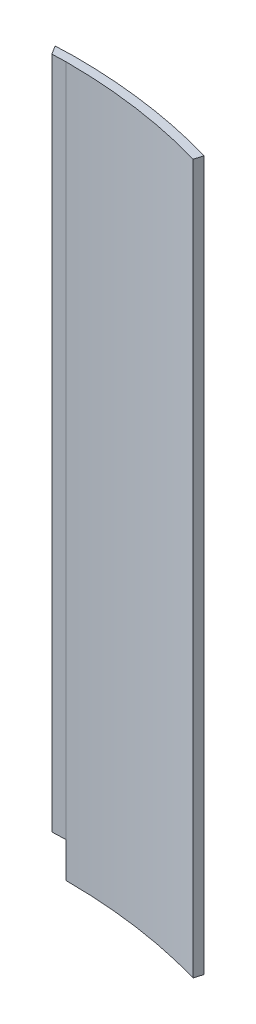
ISO-10303-21;
HEADER;
FILE_DESCRIPTION(('STEP AP214'),'2;1');
FILE_NAME('part.step','',(''),(''),'','','');
FILE_SCHEMA(('AUTOMOTIVE_DESIGN { 1 0 10303 214 1 1 1 1 }'));
ENDSEC;
DATA;
#1=APPLICATION_CONTEXT('core data for automotive mechanical design processes');
#2=APPLICATION_PROTOCOL_DEFINITION('international standard','automotive_design',2000,#1);
#3=PRODUCT_CONTEXT('',#1,'mechanical');
#4=PRODUCT('Part','Part','',(#3));
#5=PRODUCT_RELATED_PRODUCT_CATEGORY('part','',(#4));
#6=PRODUCT_DEFINITION_FORMATION('','',#4);
#7=PRODUCT_DEFINITION_CONTEXT('part definition',#1,'design');
#8=PRODUCT_DEFINITION('design','',#6,#7);
#9=PRODUCT_DEFINITION_SHAPE('','',#8);
#10=(LENGTH_UNIT() NAMED_UNIT(*) SI_UNIT(.MILLI.,.METRE.));
#11=(NAMED_UNIT(*) PLANE_ANGLE_UNIT() SI_UNIT($,.RADIAN.));
#12=(NAMED_UNIT(*) SI_UNIT($,.STERADIAN.) SOLID_ANGLE_UNIT());
#13=UNCERTAINTY_MEASURE_WITH_UNIT(LENGTH_MEASURE(1.E-05),#10,'distance_accuracy_value','');
#14=(GEOMETRIC_REPRESENTATION_CONTEXT(3) GLOBAL_UNCERTAINTY_ASSIGNED_CONTEXT((#13)) GLOBAL_UNIT_ASSIGNED_CONTEXT((#10,
#11,#12)) REPRESENTATION_CONTEXT('',''));
#15=CARTESIAN_POINT('',(0.,0.,0.));
#16=DIRECTION('',(0.,0.,1.));
#17=DIRECTION('',(1.,0.,0.));
#18=AXIS2_PLACEMENT_3D('',#15,#16,#17);
#19=CARTESIAN_POINT('',(0.,2000.,0.));
#20=DIRECTION('',(0.,-1.,0.));
#21=DIRECTION('',(0.,0.,-1.));
#22=AXIS2_PLACEMENT_3D('',#19,#20,#21);
#23=CYLINDRICAL_SURFACE('',#22,1540.);
#24=CARTESIAN_POINT('',(0.,0.,0.));
#25=DIRECTION('',(0.,1.,0.));
#26=DIRECTION('',(0.,0.,-1.));
#27=AXIS2_PLACEMENT_3D('',#24,#25,#26);
#28=CIRCLE('',#27,1540.);
#29=CARTESIAN_POINT('',(424.481527958169,0.,-1480.34301174501));
#30=VERTEX_POINT('',#29);
#31=CARTESIAN_POINT('',(0.,0.,-1540.));
#32=VERTEX_POINT('',#31);
#33=EDGE_CURVE('E92',#30,#32,#28,.T.);
#34=ORIENTED_EDGE('',*,*,#33,.T.);
#35=DIRECTION('',(0.,-1.,0.));
#36=VECTOR('',#35,1.);
#37=CARTESIAN_POINT('',(0.,2000.,-1540.));
#38=LINE('',#37,#36);
#39=CARTESIAN_POINT('',(0.,100.,-1540.));
#40=VERTEX_POINT('',#39);
#41=EDGE_CURVE('E43',#40,#32,#38,.T.);
#42=ORIENTED_EDGE('',*,*,#41,.F.);
#43=CARTESIAN_POINT('',(0.,2000.,-1540.));
#44=VERTEX_POINT('',#43);
#45=EDGE_CURVE('E11',#44,#40,#38,.T.);
#46=ORIENTED_EDGE('',*,*,#45,.F.);
#47=CARTESIAN_POINT('',(0.,2000.,0.));
#48=DIRECTION('',(0.,1.,0.));
#49=DIRECTION('',(0.,0.,-1.));
#50=AXIS2_PLACEMENT_3D('',#47,#48,#49);
#51=CIRCLE('',#50,1540.);
#52=CARTESIAN_POINT('',(424.481527958169,2000.,-1480.34301174501));
#53=VERTEX_POINT('',#52);
#54=EDGE_CURVE('E86',#53,#44,#51,.T.);
#55=ORIENTED_EDGE('',*,*,#54,.F.);
#56=DIRECTION('',(0.,-1.,0.));
#57=VECTOR('',#56,1.);
#58=CARTESIAN_POINT('',(424.481527958169,2000.,-1480.34301174501));
#59=LINE('',#58,#57);
#60=EDGE_CURVE('E79',#53,#30,#59,.T.);
#61=ORIENTED_EDGE('',*,*,#60,.T.);
#62=EDGE_LOOP('',(#34,#42,#46,#55,#61));
#63=FACE_BOUND('',#62,.T.);
#64=ADVANCED_FACE('F36',(#63),#23,.T.);
#65=CARTESIAN_POINT('',(0.,2000.,-1540.));
#66=DIRECTION('',(1.,0.,0.));
#67=DIRECTION('',(0.,0.,-1.));
#68=AXIS2_PLACEMENT_3D('',#65,#66,#67);
#69=PLANE('',#68);
#70=DIRECTION('',(0.,-1.,0.));
#71=VECTOR('',#70,1.);
#72=CARTESIAN_POINT('',(0.,2000.,-1515.));
#73=LINE('',#72,#71);
#74=CARTESIAN_POINT('',(0.,100.,-1515.));
#75=VERTEX_POINT('',#74);
#76=CARTESIAN_POINT('',(0.,0.,-1515.));
#77=VERTEX_POINT('',#76);
#78=EDGE_CURVE('E107',#75,#77,#73,.T.);
#79=ORIENTED_EDGE('',*,*,#78,.F.);
#80=DIRECTION('',(0.,0.,-1.));
#81=VECTOR('',#80,1.);
#82=CARTESIAN_POINT('',(0.,100.,0.));
#83=LINE('',#82,#81);
#84=EDGE_CURVE('E101',#75,#40,#83,.T.);
#85=ORIENTED_EDGE('',*,*,#84,.T.);
#86=ORIENTED_EDGE('',*,*,#41,.T.);
#87=DIRECTION('',(0.,0.,1.));
#88=VECTOR('',#87,1.);
#89=CARTESIAN_POINT('',(0.,0.,-1540.));
#90=LINE('',#89,#88);
#91=EDGE_CURVE('E97',#32,#77,#90,.T.);
#92=ORIENTED_EDGE('',*,*,#91,.T.);
#93=EDGE_LOOP('',(#79,#85,#86,#92));
#94=FACE_BOUND('',#93,.T.);
#95=ADVANCED_FACE('F118',(#94),#69,.F.);
#96=CARTESIAN_POINT('',(0.,2000.,0.));
#97=DIRECTION('',(0.,-1.,0.));
#98=DIRECTION('',(0.,0.,-1.));
#99=AXIS2_PLACEMENT_3D('',#96,#97,#98);
#100=CYLINDRICAL_SURFACE('',#99,1515.);
#101=CARTESIAN_POINT('',(0.,0.,0.));
#102=DIRECTION('',(0.,-1.,0.));
#103=DIRECTION('',(0.,0.,-1.));
#104=AXIS2_PLACEMENT_3D('',#101,#102,#103);
#105=CIRCLE('',#104,1515.);
#106=CARTESIAN_POINT('',(417.590594062744,0.,-1456.31146934656));
#107=VERTEX_POINT('',#106);
#108=EDGE_CURVE('E87',#77,#107,#105,.T.);
#109=ORIENTED_EDGE('',*,*,#108,.T.);
#110=DIRECTION('',(0.,-1.,0.));
#111=VECTOR('',#110,1.);
#112=CARTESIAN_POINT('',(417.590594062744,2000.,-1456.31146934656));
#113=LINE('',#112,#111);
#114=CARTESIAN_POINT('',(417.590594062744,2000.,-1456.31146934656));
#115=VERTEX_POINT('',#114);
#116=EDGE_CURVE('E82',#115,#107,#113,.T.);
#117=ORIENTED_EDGE('',*,*,#116,.F.);
#118=CARTESIAN_POINT('',(0.,2000.,0.));
#119=DIRECTION('',(0.,-1.,0.));
#120=DIRECTION('',(0.,0.,-1.));
#121=AXIS2_PLACEMENT_3D('',#118,#119,#120);
#122=CIRCLE('',#121,1515.);
#123=CARTESIAN_POINT('',(0.,2000.,-1515.));
#124=VERTEX_POINT('',#123);
#125=EDGE_CURVE('E163',#124,#115,#122,.T.);
#126=ORIENTED_EDGE('',*,*,#125,.F.);
#127=EDGE_CURVE('E108',#124,#75,#73,.T.);
#128=ORIENTED_EDGE('',*,*,#127,.T.);
#129=ORIENTED_EDGE('',*,*,#78,.T.);
#130=EDGE_LOOP('',(#109,#117,#126,#128,#129));
#131=FACE_BOUND('',#130,.T.);
#132=ADVANCED_FACE('F115',(#131),#100,.F.);
#133=CARTESIAN_POINT('',(424.481527958169,2000.,-1480.34301174501));
#134=DIRECTION('',(-0.961261695938321,0.,-0.275637355816991));
#135=DIRECTION('',(-0.275637355816991,0.,0.961261695938321));
#136=AXIS2_PLACEMENT_3D('',#133,#134,#135);
#137=PLANE('',#136);
#138=DIRECTION('',(0.275637355816991,0.,-0.961261695938321));
#139=VECTOR('',#138,1.);
#140=CARTESIAN_POINT('',(424.481527958169,0.,-1480.34301174501));
#141=LINE('',#140,#139);
#142=EDGE_CURVE('E76',#107,#30,#141,.T.);
#143=ORIENTED_EDGE('',*,*,#142,.T.);
#144=ORIENTED_EDGE('',*,*,#60,.F.);
#145=DIRECTION('',(0.275637355816991,0.,-0.961261695938321));
#146=VECTOR('',#145,1.);
#147=CARTESIAN_POINT('',(424.481527958169,2000.,-1480.34301174501));
#148=LINE('',#147,#146);
#149=EDGE_CURVE('E57',#115,#53,#148,.T.);
#150=ORIENTED_EDGE('',*,*,#149,.F.);
#151=ORIENTED_EDGE('',*,*,#116,.T.);
#152=EDGE_LOOP('',(#143,#144,#150,#151));
#153=FACE_BOUND('',#152,.T.);
#154=ADVANCED_FACE('F78',(#153),#137,.F.);
#155=CARTESIAN_POINT('',(0.,2000.,0.));
#156=DIRECTION('',(0.,-1.,0.));
#157=DIRECTION('',(0.,0.,-1.));
#158=AXIS2_PLACEMENT_3D('',#155,#156,#157);
#159=PLANE('',#158);
#160=ORIENTED_EDGE('',*,*,#54,.T.);
#161=DIRECTION('',(-0.999390827019162,0.,0.0348994967006073));
#162=VECTOR('',#161,1.);
#163=CARTESIAN_POINT('',(-53.7124847800655,2000.,-1538.12431870027));
#164=LINE('',#163,#162);
#165=CARTESIAN_POINT('',(-53.7124847830172,2000.,-1538.12431870017));
#166=VERTEX_POINT('',#165);
#167=EDGE_CURVE('E125',#44,#166,#164,.T.);
#168=ORIENTED_EDGE('',*,*,#167,.T.);
#169=DIRECTION('',(0.52991926423161,0.,0.848048096157423));
#170=VECTOR('',#169,1.);
#171=CARTESIAN_POINT('',(652.599245889357,2000.,-407.789267833692));
#172=LINE('',#171,#170);
#173=CARTESIAN_POINT('',(-38.4243520844523,2000.,-1513.65819205799));
#174=VERTEX_POINT('',#173);
#175=EDGE_CURVE('E165',#166,#174,#172,.T.);
#176=ORIENTED_EDGE('',*,*,#175,.T.);
#177=DIRECTION('',(-0.999390827019094,0.,0.03489949670256));
#178=VECTOR('',#177,1.);
#179=CARTESIAN_POINT('',(-52.8405288612642,2000.,-1513.15476807181));
#180=LINE('',#179,#178);
#181=EDGE_CURVE('E156',#124,#174,#180,.T.);
#182=ORIENTED_EDGE('',*,*,#181,.F.);
#183=ORIENTED_EDGE('',*,*,#125,.T.);
#184=ORIENTED_EDGE('',*,*,#149,.T.);
#185=EDGE_LOOP('',(#160,#168,#176,#182,#183,#184));
#186=FACE_BOUND('',#185,.T.);
#187=ADVANCED_FACE('F164',(#186),#159,.F.);
#188=CARTESIAN_POINT('',(0.,0.,0.));
#189=DIRECTION('',(0.,-1.,0.));
#190=DIRECTION('',(0.,0.,-1.));
#191=AXIS2_PLACEMENT_3D('',#188,#189,#190);
#192=PLANE('',#191);
#193=ORIENTED_EDGE('',*,*,#33,.F.);
#194=ORIENTED_EDGE('',*,*,#142,.F.);
#195=ORIENTED_EDGE('',*,*,#108,.F.);
#196=ORIENTED_EDGE('',*,*,#91,.F.);
#197=EDGE_LOOP('',(#193,#194,#195,#196));
#198=FACE_BOUND('',#197,.T.);
#199=ADVANCED_FACE('F95',(#198),#192,.T.);
#200=CARTESIAN_POINT('',(-52.8405288612642,40.1759089728917,-1513.15476807181));
#201=DIRECTION('',(-0.03489949670256,0.,-0.999390827019094));
#202=DIRECTION('',(-0.999390827019094,0.,0.03489949670256));
#203=AXIS2_PLACEMENT_3D('',#200,#201,#202);
#204=PLANE('',#203);
#205=DIRECTION('',(0.,1.,0.));
#206=VECTOR('',#205,1.);
#207=CARTESIAN_POINT('',(-38.4243520844523,40.1759089728917,-1513.65819205799));
#208=LINE('',#207,#206);
#209=CARTESIAN_POINT('',(-38.4243520844523,100.,-1513.65819205799));
#210=VERTEX_POINT('',#209);
#211=EDGE_CURVE('E150',#210,#174,#208,.T.);
#212=ORIENTED_EDGE('',*,*,#211,.F.);
#213=DIRECTION('',(0.999390827019094,0.,-0.03489949670256));
#214=VECTOR('',#213,1.);
#215=CARTESIAN_POINT('',(-52.8405288612642,100.,-1513.15476807181));
#216=LINE('',#215,#214);
#217=EDGE_CURVE('E139',#210,#75,#216,.T.);
#218=ORIENTED_EDGE('',*,*,#217,.T.);
#219=ORIENTED_EDGE('',*,*,#127,.F.);
#220=ORIENTED_EDGE('',*,*,#181,.T.);
#221=EDGE_LOOP('',(#212,#218,#219,#220));
#222=FACE_BOUND('',#221,.T.);
#223=ADVANCED_FACE('F154',(#222),#204,.F.);
#224=CARTESIAN_POINT('',(652.599245889357,40.1759089728917,-407.789267833692));
#225=DIRECTION('',(-0.848048096157422,0.,0.52991926423161));
#226=DIRECTION('',(0.52991926423161,0.,0.848048096157423));
#227=AXIS2_PLACEMENT_3D('',#224,#225,#226);
#228=PLANE('',#227);
#229=DIRECTION('',(-0.52991926423161,0.,-0.848048096157423));
#230=VECTOR('',#229,1.);
#231=CARTESIAN_POINT('',(652.599245889357,100.,-407.789267833692));
#232=LINE('',#231,#230);
#233=CARTESIAN_POINT('',(-53.7124847830172,100.,-1538.12431870017));
#234=VERTEX_POINT('',#233);
#235=EDGE_CURVE('E142',#210,#234,#232,.T.);
#236=ORIENTED_EDGE('',*,*,#235,.F.);
#237=ORIENTED_EDGE('',*,*,#211,.T.);
#238=ORIENTED_EDGE('',*,*,#175,.F.);
#239=DIRECTION('',(0.,1.,0.));
#240=VECTOR('',#239,1.);
#241=CARTESIAN_POINT('',(-53.7124847830172,40.1759089728917,-1538.12431870017));
#242=LINE('',#241,#240);
#243=EDGE_CURVE('E152',#234,#166,#242,.T.);
#244=ORIENTED_EDGE('',*,*,#243,.F.);
#245=EDGE_LOOP('',(#236,#237,#238,#244));
#246=FACE_BOUND('',#245,.T.);
#247=ADVANCED_FACE('F148',(#246),#228,.T.);
#248=CARTESIAN_POINT('',(-53.7124847800655,40.1759089728917,-1538.12431870027));
#249=DIRECTION('',(-0.0348994967006072,0.,-0.999390827019162));
#250=DIRECTION('',(-0.999390827019162,0.,0.0348994967006073));
#251=AXIS2_PLACEMENT_3D('',#248,#249,#250);
#252=PLANE('',#251);
#253=DIRECTION('',(0.999390827019162,0.,-0.0348994967006073));
#254=VECTOR('',#253,1.);
#255=CARTESIAN_POINT('',(-53.7124847800655,100.,-1538.12431870027));
#256=LINE('',#255,#254);
#257=EDGE_CURVE('E98',#234,#40,#256,.T.);
#258=ORIENTED_EDGE('',*,*,#257,.F.);
#259=ORIENTED_EDGE('',*,*,#243,.T.);
#260=ORIENTED_EDGE('',*,*,#167,.F.);
#261=ORIENTED_EDGE('',*,*,#45,.T.);
#262=EDGE_LOOP('',(#258,#259,#260,#261));
#263=FACE_BOUND('',#262,.T.);
#264=ADVANCED_FACE('F223',(#263),#252,.T.);
#265=CARTESIAN_POINT('',(0.,100.,0.));
#266=DIRECTION('',(0.,1.,0.));
#267=DIRECTION('',(-0.999390827019097,0.,0.0348994967024837));
#268=AXIS2_PLACEMENT_3D('',#265,#266,#267);
#269=PLANE('',#268);
#270=ORIENTED_EDGE('',*,*,#217,.F.);
#271=ORIENTED_EDGE('',*,*,#235,.T.);
#272=ORIENTED_EDGE('',*,*,#257,.T.);
#273=ORIENTED_EDGE('',*,*,#84,.F.);
#274=EDGE_LOOP('',(#270,#271,#272,#273));
#275=FACE_BOUND('',#274,.T.);
#276=ADVANCED_FACE('F141',(#275),#269,.F.);
#277=CLOSED_SHELL('',(#64,#95,#132,#154,#187,#199,#223,#247,#264,#276));
#278=MANIFOLD_SOLID_BREP('B2',#277);
#279=ADVANCED_BREP_SHAPE_REPRESENTATION('',(#18,#278),#14);
#280=SHAPE_DEFINITION_REPRESENTATION(#9,#279);
ENDSEC;
END-ISO-10303-21;
